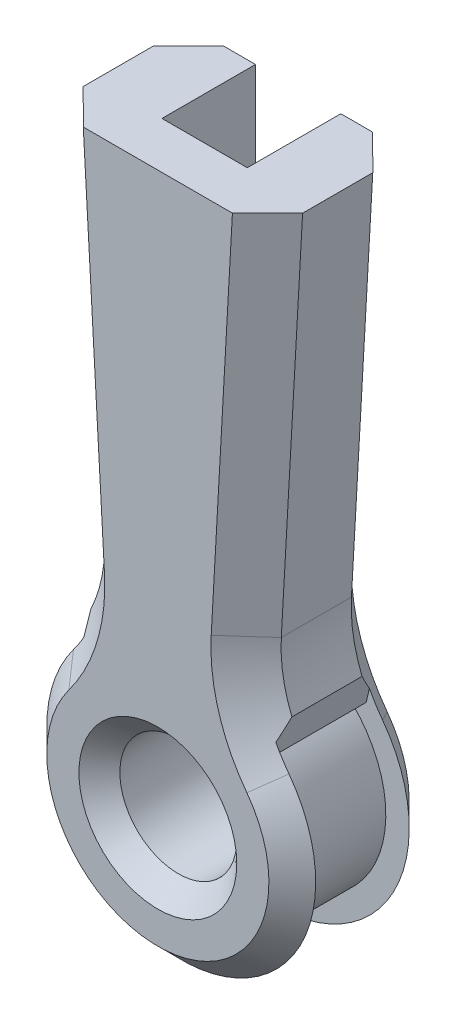
ISO-10303-21;
HEADER;
FILE_DESCRIPTION(('STEP AP214'),'2;1');
FILE_NAME('part.step','',(''),(''),'','','');
FILE_SCHEMA(('AUTOMOTIVE_DESIGN { 1 0 10303 214 1 1 1 1 }'));
ENDSEC;
DATA;
#1=APPLICATION_CONTEXT('core data for automotive mechanical design processes');
#2=APPLICATION_PROTOCOL_DEFINITION('international standard','automotive_design',2000,#1);
#3=PRODUCT_CONTEXT('',#1,'mechanical');
#4=PRODUCT('Part','Part','',(#3));
#5=PRODUCT_RELATED_PRODUCT_CATEGORY('part','',(#4));
#6=PRODUCT_DEFINITION_FORMATION('','',#4);
#7=PRODUCT_DEFINITION_CONTEXT('part definition',#1,'design');
#8=PRODUCT_DEFINITION('design','',#6,#7);
#9=PRODUCT_DEFINITION_SHAPE('','',#8);
#10=(LENGTH_UNIT() NAMED_UNIT(*) SI_UNIT(.MILLI.,.METRE.));
#11=(NAMED_UNIT(*) PLANE_ANGLE_UNIT() SI_UNIT($,.RADIAN.));
#12=(NAMED_UNIT(*) SI_UNIT($,.STERADIAN.) SOLID_ANGLE_UNIT());
#13=UNCERTAINTY_MEASURE_WITH_UNIT(LENGTH_MEASURE(1.E-05),#10,'distance_accuracy_value','');
#14=(GEOMETRIC_REPRESENTATION_CONTEXT(3) GLOBAL_UNCERTAINTY_ASSIGNED_CONTEXT((#13)) GLOBAL_UNIT_ASSIGNED_CONTEXT((#10,
#11,#12)) REPRESENTATION_CONTEXT('',''));
#15=CARTESIAN_POINT('',(0.,0.,0.));
#16=DIRECTION('',(0.,0.,1.));
#17=DIRECTION('',(1.,0.,0.));
#18=AXIS2_PLACEMENT_3D('',#15,#16,#17);
#19=CARTESIAN_POINT('',(0.,-148.,3.));
#20=DIRECTION('',(0.,0.,1.));
#21=DIRECTION('',(1.,0.,0.));
#22=AXIS2_PLACEMENT_3D('',#19,#20,#21);
#23=CONICAL_SURFACE('',#22,12.5,0.785398163397449);
#24=DIRECTION('',(-0.56677950459761,-0.422801363725436,-0.707106781186547));
#25=VECTOR('',#24,1.);
#26=CARTESIAN_POINT('',(10.0193407784631,-140.525857215371,3.));
#27=LINE('',#26,#25);
#28=CARTESIAN_POINT('',(9.21779351618603,-141.123788638141,2.));
#29=VERTEX_POINT('',#28);
#30=CARTESIAN_POINT('',(7.61469899163194,-142.319651483682,0.));
#31=VERTEX_POINT('',#30);
#32=EDGE_CURVE('E340',#29,#31,#27,.T.);
#33=ORIENTED_EDGE('',*,*,#32,.F.);
#34=CARTESIAN_POINT('',(0.,-148.,2.));
#35=DIRECTION('',(0.,0.,1.));
#36=DIRECTION('',(1.,0.,0.));
#37=AXIS2_PLACEMENT_3D('',#34,#35,#36);
#38=CIRCLE('',#37,11.5);
#39=CARTESIAN_POINT('',(-9.21779351618602,-141.123788638141,2.));
#40=VERTEX_POINT('',#39);
#41=EDGE_CURVE('E278',#29,#40,#38,.F.);
#42=ORIENTED_EDGE('',*,*,#41,.T.);
#43=DIRECTION('',(0.566779504597611,-0.422801363725435,-0.707106781186547));
#44=VECTOR('',#43,1.);
#45=CARTESIAN_POINT('',(-10.0193407784631,-140.525857215371,3.));
#46=LINE('',#45,#44);
#47=CARTESIAN_POINT('',(-7.61469899163192,-142.319651483682,0.));
#48=VERTEX_POINT('',#47);
#49=EDGE_CURVE('E288',#40,#48,#46,.T.);
#50=ORIENTED_EDGE('',*,*,#49,.T.);
#51=CARTESIAN_POINT('',(0.,-148.,0.));
#52=DIRECTION('',(0.,0.,1.));
#53=DIRECTION('',(1.,0.,0.));
#54=AXIS2_PLACEMENT_3D('',#51,#52,#53);
#55=CIRCLE('',#54,9.5);
#56=EDGE_CURVE('E301',#31,#48,#55,.F.);
#57=ORIENTED_EDGE('',*,*,#56,.F.);
#58=EDGE_LOOP('',(#33,#42,#50,#57));
#59=FACE_BOUND('',#58,.T.);
#60=ADVANCED_FACE('F45',(#59),#23,.T.);
#61=CARTESIAN_POINT('',(0.,0.,12.));
#62=DIRECTION('',(0.,0.,1.));
#63=DIRECTION('',(1.,0.,0.));
#64=AXIS2_PLACEMENT_3D('',#61,#62,#63);
#65=PLANE('',#64);
#66=DIRECTION('',(1.,0.,0.));
#67=VECTOR('',#66,1.);
#68=CARTESIAN_POINT('',(0.,-100.,12.));
#69=LINE('',#68,#67);
#70=CARTESIAN_POINT('',(-6.37838689244292,-100.,12.));
#71=VERTEX_POINT('',#70);
#72=CARTESIAN_POINT('',(6.37838689244295,-100.,12.));
#73=VERTEX_POINT('',#72);
#74=EDGE_CURVE('E70',#71,#73,#69,.T.);
#75=ORIENTED_EDGE('',*,*,#74,.F.);
#76=DIRECTION('',(0.0563173613062711,-0.998412917993101,0.));
#77=VECTOR('',#76,1.);
#78=CARTESIAN_POINT('',(-4.56328132803304,-132.178795330494,12.));
#79=LINE('',#78,#77);
#80=CARTESIAN_POINT('',(-4.56328132803304,-132.178795330494,12.));
#81=VERTEX_POINT('',#80);
#82=EDGE_CURVE('E324',#71,#81,#79,.T.);
#83=ORIENTED_EDGE('',*,*,#82,.T.);
#84=CARTESIAN_POINT('',(-20.0386815569261,-133.051714430741,12.));
#85=DIRECTION('',(0.,0.,1.));
#86=DIRECTION('',(1.,0.,0.));
#87=AXIS2_PLACEMENT_3D('',#84,#85,#86);
#88=CIRCLE('',#87,15.5);
#89=CARTESIAN_POINT('',(-7.61469899163193,-142.319651483682,12.));
#90=VERTEX_POINT('',#89);
#91=EDGE_CURVE('E326',#81,#90,#88,.F.);
#92=ORIENTED_EDGE('',*,*,#91,.T.);
#93=CARTESIAN_POINT('',(0.,-148.,12.));
#94=DIRECTION('',(0.,0.,1.));
#95=DIRECTION('',(1.,0.,0.));
#96=AXIS2_PLACEMENT_3D('',#93,#94,#95);
#97=CIRCLE('',#96,9.5);
#98=CARTESIAN_POINT('',(7.61469899163194,-142.319651483682,12.));
#99=VERTEX_POINT('',#98);
#100=EDGE_CURVE('E328',#90,#99,#97,.T.);
#101=ORIENTED_EDGE('',*,*,#100,.T.);
#102=CARTESIAN_POINT('',(20.0386815569262,-133.051714430741,12.));
#103=DIRECTION('',(0.,0.,1.));
#104=DIRECTION('',(1.,0.,0.));
#105=AXIS2_PLACEMENT_3D('',#102,#103,#104);
#106=CIRCLE('',#105,15.5);
#107=CARTESIAN_POINT('',(4.56328132803308,-132.178795330494,12.));
#108=VERTEX_POINT('',#107);
#109=EDGE_CURVE('E330',#99,#108,#106,.F.);
#110=ORIENTED_EDGE('',*,*,#109,.T.);
#111=DIRECTION('',(0.0563173613062709,0.998412917993101,0.));
#112=VECTOR('',#111,1.);
#113=CARTESIAN_POINT('',(11.9809550159172,-0.67580833567525,12.));
#114=LINE('',#113,#112);
#115=EDGE_CURVE('E333',#108,#73,#114,.T.);
#116=ORIENTED_EDGE('',*,*,#115,.T.);
#117=EDGE_LOOP('',(#75,#83,#92,#101,#110,#116));
#118=FACE_BOUND('',#117,.T.);
#119=CARTESIAN_POINT('',(0.,-148.,12.));
#120=DIRECTION('',(0.,0.,1.));
#121=DIRECTION('',(1.,0.,0.));
#122=AXIS2_PLACEMENT_3D('',#119,#120,#121);
#123=CIRCLE('',#122,6.75000000000003);
#124=CARTESIAN_POINT('',(6.75000000000003,-148.,12.));
#125=VERTEX_POINT('',#124);
#126=EDGE_CURVE('E361',#125,#125,#123,.F.);
#127=ORIENTED_EDGE('',*,*,#126,.T.);
#128=EDGE_LOOP('',(#127));
#129=FACE_BOUND('',#128,.T.);
#130=ADVANCED_FACE('F451',(#118,#129),#65,.T.);
#131=CARTESIAN_POINT('',(0.,0.,0.));
#132=DIRECTION('',(0.,0.,1.));
#133=DIRECTION('',(1.,0.,0.));
#134=AXIS2_PLACEMENT_3D('',#131,#132,#133);
#135=PLANE('',#134);
#136=CARTESIAN_POINT('',(0.,-148.,0.));
#137=DIRECTION('',(0.,0.,1.));
#138=DIRECTION('',(1.,0.,0.));
#139=AXIS2_PLACEMENT_3D('',#136,#137,#138);
#140=CIRCLE('',#139,6.75000000000003);
#141=CARTESIAN_POINT('',(6.75000000000003,-148.,0.));
#142=VERTEX_POINT('',#141);
#143=EDGE_CURVE('E364',#142,#142,#140,.T.);
#144=ORIENTED_EDGE('',*,*,#143,.T.);
#145=EDGE_LOOP('',(#144));
#146=FACE_BOUND('',#145,.T.);
#147=DIRECTION('',(-1.,0.,0.));
#148=VECTOR('',#147,1.);
#149=CARTESIAN_POINT('',(3.65,-120.3,0.));
#150=LINE('',#149,#148);
#151=CARTESIAN_POINT('',(3.65,-120.3,0.));
#152=VERTEX_POINT('',#151);
#153=CARTESIAN_POINT('',(-3.65,-120.3,0.));
#154=VERTEX_POINT('',#153);
#155=EDGE_CURVE('E232',#152,#154,#150,.T.);
#156=ORIENTED_EDGE('',*,*,#155,.F.);
#157=DIRECTION('',(0.,-1.,0.));
#158=VECTOR('',#157,1.);
#159=CARTESIAN_POINT('',(3.65,-120.3,0.));
#160=LINE('',#159,#158);
#161=CARTESIAN_POINT('',(3.65,-100.,0.));
#162=VERTEX_POINT('',#161);
#163=EDGE_CURVE('E221',#162,#152,#160,.T.);
#164=ORIENTED_EDGE('',*,*,#163,.F.);
#165=DIRECTION('',(-1.,0.,0.));
#166=VECTOR('',#165,1.);
#167=CARTESIAN_POINT('',(29.4682113100847,-100.,0.));
#168=LINE('',#167,#166);
#169=CARTESIAN_POINT('',(6.37838689244295,-100.,0.));
#170=VERTEX_POINT('',#169);
#171=EDGE_CURVE('E237',#170,#162,#168,.T.);
#172=ORIENTED_EDGE('',*,*,#171,.F.);
#173=DIRECTION('',(-0.0563173613062709,-0.998412917993101,0.));
#174=VECTOR('',#173,1.);
#175=CARTESIAN_POINT('',(11.9809550159172,-0.67580833567525,0.));
#176=LINE('',#175,#174);
#177=CARTESIAN_POINT('',(4.56328132803308,-132.178795330494,0.));
#178=VERTEX_POINT('',#177);
#179=EDGE_CURVE('E307',#170,#178,#176,.T.);
#180=ORIENTED_EDGE('',*,*,#179,.T.);
#181=CARTESIAN_POINT('',(20.0386815569262,-133.051714430741,0.));
#182=DIRECTION('',(0.,0.,1.));
#183=DIRECTION('',(1.,0.,0.));
#184=AXIS2_PLACEMENT_3D('',#181,#182,#183);
#185=CIRCLE('',#184,15.5);
#186=EDGE_CURVE('E304',#178,#31,#185,.T.);
#187=ORIENTED_EDGE('',*,*,#186,.T.);
#188=ORIENTED_EDGE('',*,*,#56,.T.);
#189=CARTESIAN_POINT('',(-20.0386815569261,-133.051714430741,0.));
#190=DIRECTION('',(0.,0.,1.));
#191=DIRECTION('',(1.,0.,0.));
#192=AXIS2_PLACEMENT_3D('',#189,#190,#191);
#193=CIRCLE('',#192,15.5);
#194=CARTESIAN_POINT('',(-4.56328132803304,-132.178795330494,0.));
#195=VERTEX_POINT('',#194);
#196=EDGE_CURVE('E299',#48,#195,#193,.T.);
#197=ORIENTED_EDGE('',*,*,#196,.T.);
#198=DIRECTION('',(-0.0563173613062711,0.998412917993101,0.));
#199=VECTOR('',#198,1.);
#200=CARTESIAN_POINT('',(-11.9809550159172,-0.675808335675253,0.));
#201=LINE('',#200,#199);
#202=CARTESIAN_POINT('',(-6.37838689244293,-100.,0.));
#203=VERTEX_POINT('',#202);
#204=EDGE_CURVE('E296',#195,#203,#201,.T.);
#205=ORIENTED_EDGE('',*,*,#204,.T.);
#206=CARTESIAN_POINT('',(-3.65,-100.,0.));
#207=VERTEX_POINT('',#206);
#208=EDGE_CURVE('E235',#207,#203,#168,.T.);
#209=ORIENTED_EDGE('',*,*,#208,.F.);
#210=DIRECTION('',(0.,1.,0.));
#211=VECTOR('',#210,1.);
#212=CARTESIAN_POINT('',(-3.65,-120.3,0.));
#213=LINE('',#212,#211);
#214=EDGE_CURVE('E215',#154,#207,#213,.T.);
#215=ORIENTED_EDGE('',*,*,#214,.F.);
#216=EDGE_LOOP('',(#156,#164,#172,#180,#187,#188,#197,#205,#209,#215));
#217=FACE_BOUND('',#216,.T.);
#218=ADVANCED_FACE('F456',(#146,#217),#135,.F.);
#219=CARTESIAN_POINT('',(-14.9761937698965,-0.844760419594066,12.));
#220=DIRECTION('',(0.998412917993101,0.0563173613062711,0.));
#221=DIRECTION('',(-0.0563173613062711,0.998412917993101,0.));
#222=AXIS2_PLACEMENT_3D('',#219,#220,#221);
#223=PLANE('',#222);
#224=DIRECTION('',(-0.0563173613062711,0.998412917993101,0.));
#225=VECTOR('',#224,1.);
#226=CARTESIAN_POINT('',(-14.9761937698965,-0.844760419594066,8.99999999999997));
#227=LINE('',#226,#225);
#228=CARTESIAN_POINT('',(-7.55852008201235,-132.347747414413,8.99999999999997));
#229=VERTEX_POINT('',#228);
#230=CARTESIAN_POINT('',(-9.38315570696334,-100.,8.99999999999997));
#231=VERTEX_POINT('',#230);
#232=EDGE_CURVE('E309',#229,#231,#227,.T.);
#233=ORIENTED_EDGE('',*,*,#232,.T.);
#234=DIRECTION('',(0.,0.,-1.));
#235=VECTOR('',#234,1.);
#236=CARTESIAN_POINT('',(-9.38315570696334,-100.,12.));
#237=LINE('',#236,#235);
#238=CARTESIAN_POINT('',(-9.38315570696334,-100.,3.00000000000001));
#239=VERTEX_POINT('',#238);
#240=EDGE_CURVE('E248',#231,#239,#237,.T.);
#241=ORIENTED_EDGE('',*,*,#240,.T.);
#242=DIRECTION('',(0.0563173613062711,-0.998412917993101,0.));
#243=VECTOR('',#242,1.);
#244=CARTESIAN_POINT('',(-14.9761937698965,-0.844760419594066,3.));
#245=LINE('',#244,#243);
#246=CARTESIAN_POINT('',(-7.55852008201235,-132.347747414413,3.));
#247=VERTEX_POINT('',#246);
#248=EDGE_CURVE('E312',#239,#247,#245,.T.);
#249=ORIENTED_EDGE('',*,*,#248,.T.);
#250=DIRECTION('',(0.,0.,1.));
#251=VECTOR('',#250,1.);
#252=CARTESIAN_POINT('',(-7.55852008201235,-132.347747414413,12.));
#253=LINE('',#252,#251);
#254=EDGE_CURVE('E284',#247,#229,#253,.T.);
#255=ORIENTED_EDGE('',*,*,#254,.T.);
#256=EDGE_LOOP('',(#233,#241,#249,#255));
#257=FACE_BOUND('',#256,.T.);
#258=ADVANCED_FACE('F515',(#257),#223,.F.);
#259=CARTESIAN_POINT('',(14.9761937698965,-0.844760419594063,12.));
#260=DIRECTION('',(-0.998412917993101,0.0563173613062709,0.));
#261=DIRECTION('',(-0.0563173613062709,-0.998412917993101,0.));
#262=AXIS2_PLACEMENT_3D('',#259,#260,#261);
#263=PLANE('',#262);
#264=DIRECTION('',(0.0563173613062709,0.998412917993101,0.));
#265=VECTOR('',#264,1.);
#266=CARTESIAN_POINT('',(14.9761937698965,-0.844760419594063,3.));
#267=LINE('',#266,#265);
#268=CARTESIAN_POINT('',(7.55852008201238,-132.347747414413,3.));
#269=VERTEX_POINT('',#268);
#270=CARTESIAN_POINT('',(9.38315570696337,-100.,3.00000000000001));
#271=VERTEX_POINT('',#270);
#272=EDGE_CURVE('E293',#269,#271,#267,.T.);
#273=ORIENTED_EDGE('',*,*,#272,.T.);
#274=DIRECTION('',(0.,0.,1.));
#275=VECTOR('',#274,1.);
#276=CARTESIAN_POINT('',(9.38315570696337,-100.,12.));
#277=LINE('',#276,#275);
#278=CARTESIAN_POINT('',(9.38315570696337,-100.,8.99999999999997));
#279=VERTEX_POINT('',#278);
#280=EDGE_CURVE('E240',#271,#279,#277,.T.);
#281=ORIENTED_EDGE('',*,*,#280,.T.);
#282=DIRECTION('',(-0.0563173613062709,-0.998412917993101,0.));
#283=VECTOR('',#282,1.);
#284=CARTESIAN_POINT('',(7.55852008201238,-132.347747414413,8.99999999999997));
#285=LINE('',#284,#283);
#286=CARTESIAN_POINT('',(7.55852008201238,-132.347747414413,8.99999999999997));
#287=VERTEX_POINT('',#286);
#288=EDGE_CURVE('E291',#279,#287,#285,.T.);
#289=ORIENTED_EDGE('',*,*,#288,.T.);
#290=DIRECTION('',(0.,0.,1.));
#291=VECTOR('',#290,1.);
#292=CARTESIAN_POINT('',(7.55852008201238,-132.347747414413,0.));
#293=LINE('',#292,#291);
#294=EDGE_CURVE('E287',#287,#269,#293,.F.);
#295=ORIENTED_EDGE('',*,*,#294,.T.);
#296=EDGE_LOOP('',(#273,#281,#289,#295));
#297=FACE_BOUND('',#296,.T.);
#298=ADVANCED_FACE('F535',(#297),#263,.F.);
#299=CARTESIAN_POINT('',(0.,-148.,12.));
#300=DIRECTION('',(0.,0.,-1.));
#301=DIRECTION('',(-1.,0.,0.));
#302=AXIS2_PLACEMENT_3D('',#299,#300,#301);
#303=CYLINDRICAL_SURFACE('',#302,5.00000000000001);
#304=CARTESIAN_POINT('',(0.,-148.,10.25));
#305=DIRECTION('',(0.,0.,1.));
#306=DIRECTION('',(1.,0.,0.));
#307=AXIS2_PLACEMENT_3D('',#304,#305,#306);
#308=CIRCLE('',#307,5.00000000000001);
#309=CARTESIAN_POINT('',(5.00000000000001,-148.,10.25));
#310=VERTEX_POINT('',#309);
#311=EDGE_CURVE('E358',#310,#310,#308,.T.);
#312=ORIENTED_EDGE('',*,*,#311,.T.);
#313=EDGE_LOOP('',(#312));
#314=FACE_BOUND('',#313,.T.);
#315=CARTESIAN_POINT('',(0.,-148.,1.75000000000004));
#316=DIRECTION('',(0.,0.,1.));
#317=DIRECTION('',(1.,0.,0.));
#318=AXIS2_PLACEMENT_3D('',#315,#316,#317);
#319=CIRCLE('',#318,5.00000000000001);
#320=CARTESIAN_POINT('',(5.00000000000001,-148.,1.75000000000004));
#321=VERTEX_POINT('',#320);
#322=EDGE_CURVE('E336',#321,#321,#319,.F.);
#323=ORIENTED_EDGE('',*,*,#322,.T.);
#324=EDGE_LOOP('',(#323));
#325=FACE_BOUND('',#324,.T.);
#326=ADVANCED_FACE('F623',(#314,#325),#303,.F.);
#327=CARTESIAN_POINT('',(-20.0386815569261,-133.051714430741,12.));
#328=DIRECTION('',(0.,0.,-1.));
#329=DIRECTION('',(-1.,0.,0.));
#330=AXIS2_PLACEMENT_3D('',#327,#328,#329);
#331=CYLINDRICAL_SURFACE('',#330,12.5);
#332=CARTESIAN_POINT('',(-20.0386815569261,-133.051714430741,3.));
#333=DIRECTION('',(0.,0.,1.));
#334=DIRECTION('',(1.,0.,0.));
#335=AXIS2_PLACEMENT_3D('',#332,#333,#334);
#336=CIRCLE('',#335,12.5);
#337=CARTESIAN_POINT('',(-8.73789473468378,-138.394206096456,3.));
#338=VERTEX_POINT('',#337);
#339=EDGE_CURVE('E321',#247,#338,#336,.F.);
#340=ORIENTED_EDGE('',*,*,#339,.T.);
#341=DIRECTION('',(0.,0.,-1.));
#342=VECTOR('',#341,1.);
#343=CARTESIAN_POINT('',(-8.73789473468378,-138.394206096456,12.));
#344=LINE('',#343,#342);
#345=CARTESIAN_POINT('',(-8.73789473468378,-138.394206096456,8.99999999999997));
#346=VERTEX_POINT('',#345);
#347=EDGE_CURVE('E382',#338,#346,#344,.F.);
#348=ORIENTED_EDGE('',*,*,#347,.T.);
#349=CARTESIAN_POINT('',(-20.0386815569261,-133.051714430741,8.99999999999997));
#350=DIRECTION('',(0.,0.,1.));
#351=DIRECTION('',(1.,0.,0.));
#352=AXIS2_PLACEMENT_3D('',#349,#350,#351);
#353=CIRCLE('',#352,12.5);
#354=EDGE_CURVE('E319',#346,#229,#353,.T.);
#355=ORIENTED_EDGE('',*,*,#354,.T.);
#356=ORIENTED_EDGE('',*,*,#254,.F.);
#357=EDGE_LOOP('',(#340,#348,#355,#356));
#358=FACE_BOUND('',#357,.T.);
#359=ADVANCED_FACE('F551',(#358),#331,.F.);
#360=CARTESIAN_POINT('',(20.0386815569262,-133.051714430741,12.));
#361=DIRECTION('',(0.,0.,-1.));
#362=DIRECTION('',(-1.,0.,0.));
#363=AXIS2_PLACEMENT_3D('',#360,#361,#362);
#364=CYLINDRICAL_SURFACE('',#363,12.5);
#365=CARTESIAN_POINT('',(20.0386815569262,-133.051714430741,8.99999999999997));
#366=DIRECTION('',(0.,0.,1.));
#367=DIRECTION('',(1.,0.,0.));
#368=AXIS2_PLACEMENT_3D('',#365,#366,#367);
#369=CIRCLE('',#368,12.5);
#370=CARTESIAN_POINT('',(8.46493919013486,-137.773841877893,8.99999999999997));
#371=VERTEX_POINT('',#370);
#372=EDGE_CURVE('E314',#287,#371,#369,.T.);
#373=ORIENTED_EDGE('',*,*,#372,.T.);
#374=DIRECTION('',(0.,0.,-1.));
#375=VECTOR('',#374,1.);
#376=CARTESIAN_POINT('',(8.46493919013486,-137.773841877893,12.));
#377=LINE('',#376,#375);
#378=CARTESIAN_POINT('',(8.46493919013486,-137.773841877893,3.));
#379=VERTEX_POINT('',#378);
#380=EDGE_CURVE('E490',#371,#379,#377,.T.);
#381=ORIENTED_EDGE('',*,*,#380,.T.);
#382=CARTESIAN_POINT('',(20.0386815569262,-133.051714430741,3.));
#383=DIRECTION('',(0.,0.,1.));
#384=DIRECTION('',(1.,0.,0.));
#385=AXIS2_PLACEMENT_3D('',#382,#383,#384);
#386=CIRCLE('',#385,12.5);
#387=EDGE_CURVE('E317',#379,#269,#386,.F.);
#388=ORIENTED_EDGE('',*,*,#387,.T.);
#389=ORIENTED_EDGE('',*,*,#294,.F.);
#390=EDGE_LOOP('',(#373,#381,#388,#389));
#391=FACE_BOUND('',#390,.T.);
#392=ADVANCED_FACE('F562',(#391),#364,.F.);
#393=CARTESIAN_POINT('',(-20.0386815569261,-133.051714430741,0.));
#394=DIRECTION('',(0.,0.,-1.));
#395=DIRECTION('',(-1.,0.,0.));
#396=AXIS2_PLACEMENT_3D('',#393,#394,#395);
#397=CONICAL_SURFACE('',#396,15.5,0.785398163397449);
#398=CARTESIAN_POINT('',(-20.0386815569261,-133.051714430741,2.));
#399=DIRECTION('',(0.,0.,1.));
#400=DIRECTION('',(1.,0.,0.));
#401=AXIS2_PLACEMENT_3D('',#398,#399,#400);
#402=CIRCLE('',#401,13.5);
#403=CARTESIAN_POINT('',(-8.34472550527088,-139.797186383241,2.));
#404=VERTEX_POINT('',#403);
#405=EDGE_CURVE('E281',#40,#404,#402,.T.);
#406=ORIENTED_EDGE('',*,*,#405,.T.);
#407=CARTESIAN_POINT('',(-8.34472550527088,-139.797186383241,2.));
#408=CARTESIAN_POINT('',(-8.37705683128127,-139.681815673519,2.08565066544466));
#409=CARTESIAN_POINT('',(-8.40948743239469,-139.566090711729,2.17078839612603));
#410=CARTESIAN_POINT('',(-8.47455764509215,-139.333894957733,2.33993325094384));
#411=CARTESIAN_POINT('',(-8.50719723510438,-139.217424242504,2.42394048907926));
#412=CARTESIAN_POINT('',(-8.57270283687168,-138.983674851458,2.59073805021443));
#413=CARTESIAN_POINT('',(-8.60556885129342,-138.866396166125,2.67352835884592));
#414=CARTESIAN_POINT('',(-8.67154541087083,-138.630966214968,2.83778652933481));
#415=CARTESIAN_POINT('',(-8.70465598054099,-138.512814861667,2.91925425592396));
#416=CARTESIAN_POINT('',(-8.73789473468378,-138.394206096456,3.));
#417=B_SPLINE_CURVE_WITH_KNOTS('',3,(#407,#408,#409,#410,#411,#412,#413,#414,#415,#416),
.UNSPECIFIED.,.F.,.F.,(4,2,2,2,4),(0.,0.441843677195251,0.883642459824597,1.32544645457914,
1.76729535411745),.UNSPECIFIED.);
#418=EDGE_CURVE('E375',#404,#338,#417,.T.);
#419=ORIENTED_EDGE('',*,*,#418,.T.);
#420=ORIENTED_EDGE('',*,*,#339,.F.);
#421=DIRECTION('',(-0.705984544737171,-0.0398223880781978,0.707106781186547));
#422=VECTOR('',#421,1.);
#423=CARTESIAN_POINT('',(-4.56328132803304,-132.178795330494,0.));
#424=LINE('',#423,#422);
#425=EDGE_CURVE('E343',#195,#247,#424,.T.);
#426=ORIENTED_EDGE('',*,*,#425,.F.);
#427=ORIENTED_EDGE('',*,*,#196,.F.);
#428=ORIENTED_EDGE('',*,*,#49,.F.);
#429=EDGE_LOOP('',(#406,#419,#420,#426,#427,#428));
#430=FACE_BOUND('',#429,.T.);
#431=ADVANCED_FACE('F385',(#430),#397,.F.);
#432=CARTESIAN_POINT('',(-14.9761937698965,-0.844760419594066,3.));
#433=DIRECTION('',(0.70598454473717,0.0398223880781972,0.707106781186548));
#434=DIRECTION('',(0.0563173613062711,-0.998412917993101,0.));
#435=AXIS2_PLACEMENT_3D('',#432,#433,#434);
#436=PLANE('',#435);
#437=DIRECTION('',(0.70766812186927,0.,-0.706544994526195));
#438=VECTOR('',#437,1.);
#439=CARTESIAN_POINT('',(-12.1841165654393,-100.,5.79651550389546));
#440=LINE('',#439,#438);
#441=EDGE_CURVE('E251',#203,#239,#440,.F.);
#442=ORIENTED_EDGE('',*,*,#441,.F.);
#443=ORIENTED_EDGE('',*,*,#204,.F.);
#444=ORIENTED_EDGE('',*,*,#425,.T.);
#445=ORIENTED_EDGE('',*,*,#248,.F.);
#446=EDGE_LOOP('',(#442,#443,#444,#445));
#447=FACE_BOUND('',#446,.T.);
#448=ADVANCED_FACE('F465',(#447),#436,.F.);
#449=CARTESIAN_POINT('',(20.0386815569262,-133.051714430741,0.));
#450=DIRECTION('',(0.,0.,-1.));
#451=DIRECTION('',(-1.,0.,0.));
#452=AXIS2_PLACEMENT_3D('',#449,#450,#451);
#453=CONICAL_SURFACE('',#452,15.5,0.785398163397448);
#454=CARTESIAN_POINT('',(8.46493919013486,-137.773841877893,3.));
#455=CARTESIAN_POINT('',(8.43351759752117,-137.906991768959,2.92060298992841));
#456=CARTESIAN_POINT('',(8.40224441753454,-138.039512757303,2.84009887787652));
#457=CARTESIAN_POINT('',(8.33998420024125,-138.303342196259,2.67707654162311));
#458=CARTESIAN_POINT('',(8.30899710958229,-138.434650872952,2.59455870386005));
#459=CARTESIAN_POINT('',(8.2472871312439,-138.696148658709,2.42768051410641));
#460=CARTESIAN_POINT('',(8.21656423761577,-138.826337792981,2.34332020375339));
#461=CARTESIAN_POINT('',(8.15536046037285,-139.085690537221,2.17289547716125));
#462=CARTESIAN_POINT('',(8.12487962395216,-139.214853947202,2.08683073950789));
#463=CARTESIAN_POINT('',(8.09451491925204,-139.343525245719,2.00000000000001));
#464=B_SPLINE_CURVE_WITH_KNOTS('',3,(#454,#455,#456,#457,#458,#459,#460,#461,#462,#463),
.UNSPECIFIED.,.F.,.F.,(4,2,2,2,4),(0.,0.474522499172708,0.948954641591617,1.42337607351251,
1.89788783831843),.UNSPECIFIED.);
#465=CARTESIAN_POINT('',(8.09451491925203,-139.343525245719,2.));
#466=VERTEX_POINT('',#465);
#467=EDGE_CURVE('E481',#379,#466,#464,.T.);
#468=ORIENTED_EDGE('',*,*,#467,.T.);
#469=CARTESIAN_POINT('',(20.0386815569262,-133.051714430741,2.));
#470=DIRECTION('',(0.,0.,1.));
#471=DIRECTION('',(1.,0.,0.));
#472=AXIS2_PLACEMENT_3D('',#469,#470,#471);
#473=CIRCLE('',#472,13.5);
#474=EDGE_CURVE('E369',#466,#29,#473,.T.);
#475=ORIENTED_EDGE('',*,*,#474,.T.);
#476=ORIENTED_EDGE('',*,*,#32,.T.);
#477=ORIENTED_EDGE('',*,*,#186,.F.);
#478=DIRECTION('',(-0.705984544737171,0.0398223880781978,-0.707106781186547));
#479=VECTOR('',#478,1.);
#480=CARTESIAN_POINT('',(7.55852008201239,-132.347747414413,3.));
#481=LINE('',#480,#479);
#482=EDGE_CURVE('E337',#269,#178,#481,.T.);
#483=ORIENTED_EDGE('',*,*,#482,.F.);
#484=ORIENTED_EDGE('',*,*,#387,.F.);
#485=EDGE_LOOP('',(#468,#475,#476,#477,#483,#484));
#486=FACE_BOUND('',#485,.T.);
#487=ADVANCED_FACE('F471',(#486),#453,.F.);
#488=CARTESIAN_POINT('',(14.9761937698965,-0.844760419594063,3.));
#489=DIRECTION('',(-0.70598454473717,0.039822388078197,0.707106781186548));
#490=DIRECTION('',(0.0563173613062709,0.998412917993101,0.));
#491=AXIS2_PLACEMENT_3D('',#488,#489,#490);
#492=PLANE('',#491);
#493=DIRECTION('',(0.70766812186927,0.,0.706544994526195));
#494=VECTOR('',#493,1.);
#495=CARTESIAN_POINT('',(12.1841165654393,-100.,5.79651550389544));
#496=LINE('',#495,#494);
#497=EDGE_CURVE('E246',#271,#170,#496,.F.);
#498=ORIENTED_EDGE('',*,*,#497,.F.);
#499=ORIENTED_EDGE('',*,*,#272,.F.);
#500=ORIENTED_EDGE('',*,*,#482,.T.);
#501=ORIENTED_EDGE('',*,*,#179,.F.);
#502=EDGE_LOOP('',(#498,#499,#500,#501));
#503=FACE_BOUND('',#502,.T.);
#504=ADVANCED_FACE('F430',(#503),#492,.F.);
#505=CARTESIAN_POINT('',(-11.9809550159172,-0.675808335675253,12.));
#506=DIRECTION('',(-0.705984544737173,-0.0398223880781974,0.707106781186544));
#507=DIRECTION('',(-0.0563173613062711,0.998412917993101,0.));
#508=AXIS2_PLACEMENT_3D('',#505,#506,#507);
#509=PLANE('',#508);
#510=DIRECTION('',(0.707668121869266,0.,0.706544994526198));
#511=VECTOR('',#510,1.);
#512=CARTESIAN_POINT('',(-9.18412034968437,-100.,9.19871947184467));
#513=LINE('',#512,#511);
#514=EDGE_CURVE('E244',#231,#71,#513,.T.);
#515=ORIENTED_EDGE('',*,*,#514,.F.);
#516=ORIENTED_EDGE('',*,*,#232,.F.);
#517=DIRECTION('',(-0.705984544737167,-0.0398223880781977,-0.707106781186551));
#518=VECTOR('',#517,1.);
#519=CARTESIAN_POINT('',(-4.56328132803304,-132.178795330494,12.));
#520=LINE('',#519,#518);
#521=EDGE_CURVE('E341',#81,#229,#520,.T.);
#522=ORIENTED_EDGE('',*,*,#521,.F.);
#523=ORIENTED_EDGE('',*,*,#82,.F.);
#524=EDGE_LOOP('',(#515,#516,#522,#523));
#525=FACE_BOUND('',#524,.T.);
#526=ADVANCED_FACE('F423',(#525),#509,.T.);
#527=CARTESIAN_POINT('',(-20.0386815569261,-133.051714430741,12.));
#528=DIRECTION('',(0.,0.,1.));
#529=DIRECTION('',(1.,0.,0.));
#530=AXIS2_PLACEMENT_3D('',#527,#528,#529);
#531=CONICAL_SURFACE('',#530,15.5,0.785398163397444);
#532=CARTESIAN_POINT('',(-8.73789473468378,-138.394206096456,8.99999999999997));
#533=CARTESIAN_POINT('',(-8.70465598054099,-138.512814861667,9.08074574407602));
#534=CARTESIAN_POINT('',(-8.67154541087083,-138.630966214968,9.16221347066518));
#535=CARTESIAN_POINT('',(-8.60556885129341,-138.866396166125,9.32647164115407));
#536=CARTESIAN_POINT('',(-8.57270283687167,-138.983674851458,9.40926194978557));
#537=CARTESIAN_POINT('',(-8.50719723510438,-139.217424242504,9.57605951092073));
#538=CARTESIAN_POINT('',(-8.47455764509215,-139.333894957733,9.66006674905614));
#539=CARTESIAN_POINT('',(-8.40948743239469,-139.566090711729,9.82921160387395));
#540=CARTESIAN_POINT('',(-8.37705683128127,-139.681815673519,9.91434933455532));
#541=CARTESIAN_POINT('',(-8.34472550527088,-139.797186383241,10.));
#542=B_SPLINE_CURVE_WITH_KNOTS('',3,(#532,#533,#534,#535,#536,#537,#538,#539,#540,#541),
.UNSPECIFIED.,.F.,.F.,(4,2,2,2,4),(0.,0.441848899538347,0.883652894292889,1.3254516769222,
1.76729535411749),.UNSPECIFIED.);
#543=CARTESIAN_POINT('',(-8.34472550527087,-139.797186383241,10.));
#544=VERTEX_POINT('',#543);
#545=EDGE_CURVE('E402',#346,#544,#542,.T.);
#546=ORIENTED_EDGE('',*,*,#545,.T.);
#547=CARTESIAN_POINT('',(-20.0386815569261,-133.051714430741,10.));
#548=DIRECTION('',(0.,0.,1.));
#549=DIRECTION('',(1.,0.,0.));
#550=AXIS2_PLACEMENT_3D('',#547,#548,#549);
#551=CIRCLE('',#550,13.5);
#552=CARTESIAN_POINT('',(-9.217793516186,-141.123788638141,10.));
#553=VERTEX_POINT('',#552);
#554=EDGE_CURVE('E276',#553,#544,#551,.T.);
#555=ORIENTED_EDGE('',*,*,#554,.F.);
#556=DIRECTION('',(-0.566779504597608,0.422801363725434,-0.70710678118655));
#557=VECTOR('',#556,1.);
#558=CARTESIAN_POINT('',(-7.61469899163193,-142.319651483682,12.));
#559=LINE('',#558,#557);
#560=EDGE_CURVE('E351',#90,#553,#559,.T.);
#561=ORIENTED_EDGE('',*,*,#560,.F.);
#562=ORIENTED_EDGE('',*,*,#91,.F.);
#563=ORIENTED_EDGE('',*,*,#521,.T.);
#564=ORIENTED_EDGE('',*,*,#354,.F.);
#565=EDGE_LOOP('',(#546,#555,#561,#562,#563,#564));
#566=FACE_BOUND('',#565,.T.);
#567=ADVANCED_FACE('F413',(#566),#531,.F.);
#568=CARTESIAN_POINT('',(0.,-148.,12.));
#569=DIRECTION('',(0.,0.,-1.));
#570=DIRECTION('',(-1.,0.,0.));
#571=AXIS2_PLACEMENT_3D('',#568,#569,#570);
#572=CONICAL_SURFACE('',#571,9.5,0.785398163397444);
#573=CARTESIAN_POINT('',(0.,-148.,10.));
#574=DIRECTION('',(0.,0.,1.));
#575=DIRECTION('',(1.,0.,0.));
#576=AXIS2_PLACEMENT_3D('',#573,#574,#575);
#577=CIRCLE('',#576,11.5);
#578=CARTESIAN_POINT('',(9.21779351618602,-141.123788638141,10.));
#579=VERTEX_POINT('',#578);
#580=EDGE_CURVE('E273',#579,#553,#577,.F.);
#581=ORIENTED_EDGE('',*,*,#580,.F.);
#582=DIRECTION('',(0.566779504597608,0.422801363725434,-0.70710678118655));
#583=VECTOR('',#582,1.);
#584=CARTESIAN_POINT('',(7.61469899163194,-142.319651483682,12.));
#585=LINE('',#584,#583);
#586=EDGE_CURVE('E348',#99,#579,#585,.T.);
#587=ORIENTED_EDGE('',*,*,#586,.F.);
#588=ORIENTED_EDGE('',*,*,#100,.F.);
#589=ORIENTED_EDGE('',*,*,#560,.T.);
#590=EDGE_LOOP('',(#581,#587,#588,#589));
#591=FACE_BOUND('',#590,.T.);
#592=ADVANCED_FACE('F422',(#591),#572,.T.);
#593=CARTESIAN_POINT('',(11.9809550159172,-0.67580833567525,12.));
#594=DIRECTION('',(0.705984544737173,-0.0398223880781972,0.707106781186545));
#595=DIRECTION('',(-0.0563173613062709,-0.998412917993101,0.));
#596=AXIS2_PLACEMENT_3D('',#593,#594,#595);
#597=PLANE('',#596);
#598=DIRECTION('',(0.707668121869266,0.,-0.706544994526198));
#599=VECTOR('',#598,1.);
#600=CARTESIAN_POINT('',(9.18412034968438,-100.,9.19871947184468));
#601=LINE('',#600,#599);
#602=EDGE_CURVE('E500',#73,#279,#601,.T.);
#603=ORIENTED_EDGE('',*,*,#602,.F.);
#604=ORIENTED_EDGE('',*,*,#115,.F.);
#605=DIRECTION('',(-0.705984544737167,0.0398223880781977,0.707106781186551));
#606=VECTOR('',#605,1.);
#607=CARTESIAN_POINT('',(7.55852008201238,-132.347747414413,8.99999999999997));
#608=LINE('',#607,#606);
#609=EDGE_CURVE('E283',#287,#108,#608,.T.);
#610=ORIENTED_EDGE('',*,*,#609,.F.);
#611=ORIENTED_EDGE('',*,*,#288,.F.);
#612=EDGE_LOOP('',(#603,#604,#610,#611));
#613=FACE_BOUND('',#612,.T.);
#614=ADVANCED_FACE('F446',(#613),#597,.T.);
#615=CARTESIAN_POINT('',(20.0386815569262,-133.051714430741,12.));
#616=DIRECTION('',(0.,0.,1.));
#617=DIRECTION('',(1.,0.,0.));
#618=AXIS2_PLACEMENT_3D('',#615,#616,#617);
#619=CONICAL_SURFACE('',#618,15.5,0.785398163397444);
#620=CARTESIAN_POINT('',(20.0386815569262,-133.051714430741,10.));
#621=DIRECTION('',(0.,0.,1.));
#622=DIRECTION('',(1.,0.,0.));
#623=AXIS2_PLACEMENT_3D('',#620,#621,#622);
#624=CIRCLE('',#623,13.5);
#625=CARTESIAN_POINT('',(8.09451491925203,-139.343525245719,10.));
#626=VERTEX_POINT('',#625);
#627=EDGE_CURVE('E367',#626,#579,#624,.T.);
#628=ORIENTED_EDGE('',*,*,#627,.F.);
#629=CARTESIAN_POINT('',(8.09451491925203,-139.343525245719,10.));
#630=CARTESIAN_POINT('',(8.12487962395215,-139.214853947202,9.91316926049213));
#631=CARTESIAN_POINT('',(8.15536046037283,-139.085690537221,9.82710452283877));
#632=CARTESIAN_POINT('',(8.21656423761576,-138.826337792982,9.65667979624663));
#633=CARTESIAN_POINT('',(8.2472871312439,-138.696148658709,9.5723194858936));
#634=CARTESIAN_POINT('',(8.30899710958229,-138.434650872952,9.40544129613994));
#635=CARTESIAN_POINT('',(8.33998420024124,-138.303342196259,9.32292345837687));
#636=CARTESIAN_POINT('',(8.40224441753454,-138.039512757303,9.15990112212345));
#637=CARTESIAN_POINT('',(8.43351759752117,-137.906991768959,9.07939701007156));
#638=CARTESIAN_POINT('',(8.46493919013486,-137.773841877893,8.99999999999996));
#639=B_SPLINE_CURVE_WITH_KNOTS('',3,(#629,#630,#631,#632,#633,#634,#635,#636,#637,#638),
.UNSPECIFIED.,.F.,.F.,(4,2,2,2,4),(0.,0.474511764805861,0.948933196726822,1.42336533914576,
1.89788783831848),.UNSPECIFIED.);
#640=EDGE_CURVE('E559',#626,#371,#639,.T.);
#641=ORIENTED_EDGE('',*,*,#640,.T.);
#642=ORIENTED_EDGE('',*,*,#372,.F.);
#643=ORIENTED_EDGE('',*,*,#609,.T.);
#644=ORIENTED_EDGE('',*,*,#109,.F.);
#645=ORIENTED_EDGE('',*,*,#586,.T.);
#646=EDGE_LOOP('',(#628,#641,#642,#643,#644,#645));
#647=FACE_BOUND('',#646,.T.);
#648=ADVANCED_FACE('F438',(#647),#619,.F.);
#649=CARTESIAN_POINT('',(0.,-148.,10.25));
#650=DIRECTION('',(0.,0.,1.));
#651=DIRECTION('',(1.,0.,0.));
#652=AXIS2_PLACEMENT_3D('',#649,#650,#651);
#653=CONICAL_SURFACE('',#652,5.00000000000001,0.78539816339745);
#654=ORIENTED_EDGE('',*,*,#126,.F.);
#655=EDGE_LOOP('',(#654));
#656=FACE_BOUND('',#655,.T.);
#657=ORIENTED_EDGE('',*,*,#311,.F.);
#658=EDGE_LOOP('',(#657));
#659=FACE_BOUND('',#658,.T.);
#660=ADVANCED_FACE('F433',(#656,#659),#653,.F.);
#661=CARTESIAN_POINT('',(0.,-148.,0.));
#662=DIRECTION('',(0.,0.,-1.));
#663=DIRECTION('',(-1.,0.,0.));
#664=AXIS2_PLACEMENT_3D('',#661,#662,#663);
#665=CONICAL_SURFACE('',#664,6.75000000000003,0.785398163397445);
#666=ORIENTED_EDGE('',*,*,#322,.F.);
#667=EDGE_LOOP('',(#666));
#668=FACE_BOUND('',#667,.T.);
#669=ORIENTED_EDGE('',*,*,#143,.F.);
#670=EDGE_LOOP('',(#669));
#671=FACE_BOUND('',#670,.T.);
#672=ADVANCED_FACE('F399',(#668,#671),#665,.F.);
#673=CARTESIAN_POINT('',(0.,-148.,2.));
#674=DIRECTION('',(0.,0.,1.));
#675=DIRECTION('',(1.,0.,0.));
#676=AXIS2_PLACEMENT_3D('',#673,#674,#675);
#677=CYLINDRICAL_SURFACE('',#676,9.50000000000001);
#678=CARTESIAN_POINT('',(0.,-148.,10.));
#679=DIRECTION('',(0.,0.,-1.));
#680=DIRECTION('',(1.,0.,0.));
#681=AXIS2_PLACEMENT_3D('',#678,#679,#680);
#682=CIRCLE('',#681,9.50000000000001);
#683=CARTESIAN_POINT('',(5.86405914320215,-140.525857215371,10.));
#684=VERTEX_POINT('',#683);
#685=CARTESIAN_POINT('',(-5.86405914320215,-140.525857215371,10.));
#686=VERTEX_POINT('',#685);
#687=EDGE_CURVE('E253',#684,#686,#682,.T.);
#688=ORIENTED_EDGE('',*,*,#687,.T.);
#689=DIRECTION('',(0.,0.,1.));
#690=VECTOR('',#689,1.);
#691=CARTESIAN_POINT('',(-5.86405914320215,-140.525857215371,2.));
#692=LINE('',#691,#690);
#693=CARTESIAN_POINT('',(-5.86405914320215,-140.525857215371,2.));
#694=VERTEX_POINT('',#693);
#695=EDGE_CURVE('E263',#694,#686,#692,.T.);
#696=ORIENTED_EDGE('',*,*,#695,.F.);
#697=CARTESIAN_POINT('',(0.,-148.,2.));
#698=DIRECTION('',(0.,0.,-1.));
#699=DIRECTION('',(1.,0.,0.));
#700=AXIS2_PLACEMENT_3D('',#697,#698,#699);
#701=CIRCLE('',#700,9.50000000000001);
#702=CARTESIAN_POINT('',(5.86405914320215,-140.525857215371,2.));
#703=VERTEX_POINT('',#702);
#704=EDGE_CURVE('E254',#703,#694,#701,.T.);
#705=ORIENTED_EDGE('',*,*,#704,.F.);
#706=DIRECTION('',(0.,0.,1.));
#707=VECTOR('',#706,1.);
#708=CARTESIAN_POINT('',(5.86405914320215,-140.525857215371,2.));
#709=LINE('',#708,#707);
#710=EDGE_CURVE('E270',#703,#684,#709,.T.);
#711=ORIENTED_EDGE('',*,*,#710,.T.);
#712=EDGE_LOOP('',(#688,#696,#705,#711));
#713=FACE_BOUND('',#712,.T.);
#714=ADVANCED_FACE('F444',(#713),#677,.T.);
#715=CARTESIAN_POINT('',(10.0193407784631,-140.525857215371,2.));
#716=DIRECTION('',(0.,1.,0.));
#717=DIRECTION('',(0.,0.,1.));
#718=AXIS2_PLACEMENT_3D('',#715,#716,#717);
#719=PLANE('',#718);
#720=DIRECTION('',(-1.,0.,0.));
#721=VECTOR('',#720,1.);
#722=CARTESIAN_POINT('',(10.0193407784631,-140.525857215371,2.));
#723=LINE('',#722,#721);
#724=CARTESIAN_POINT('',(7.81550039519167,-140.525857215371,2.));
#725=VERTEX_POINT('',#724);
#726=EDGE_CURVE('E261',#725,#703,#723,.T.);
#727=ORIENTED_EDGE('',*,*,#726,.F.);
#728=DIRECTION('',(0.,0.,1.));
#729=VECTOR('',#728,1.);
#730=CARTESIAN_POINT('',(7.81550039519167,-140.525857215371,2.));
#731=LINE('',#730,#729);
#732=CARTESIAN_POINT('',(7.81550039519167,-140.525857215371,10.));
#733=VERTEX_POINT('',#732);
#734=EDGE_CURVE('E410',#725,#733,#731,.T.);
#735=ORIENTED_EDGE('',*,*,#734,.T.);
#736=DIRECTION('',(-1.,0.,0.));
#737=VECTOR('',#736,1.);
#738=CARTESIAN_POINT('',(10.0193407784631,-140.525857215371,10.));
#739=LINE('',#738,#737);
#740=EDGE_CURVE('E258',#733,#684,#739,.T.);
#741=ORIENTED_EDGE('',*,*,#740,.T.);
#742=ORIENTED_EDGE('',*,*,#710,.F.);
#743=EDGE_LOOP('',(#727,#735,#741,#742));
#744=FACE_BOUND('',#743,.T.);
#745=ADVANCED_FACE('F697',(#744),#719,.F.);
#746=CARTESIAN_POINT('',(-5.86405914320215,-140.525857215371,2.));
#747=DIRECTION('',(0.,1.,0.));
#748=DIRECTION('',(0.,0.,1.));
#749=AXIS2_PLACEMENT_3D('',#746,#747,#748);
#750=PLANE('',#749);
#751=DIRECTION('',(-1.,0.,0.));
#752=VECTOR('',#751,1.);
#753=CARTESIAN_POINT('',(-5.86405914320215,-140.525857215371,10.));
#754=LINE('',#753,#752);
#755=CARTESIAN_POINT('',(-8.14052381244395,-140.525857215371,10.));
#756=VERTEX_POINT('',#755);
#757=EDGE_CURVE('E266',#686,#756,#754,.T.);
#758=ORIENTED_EDGE('',*,*,#757,.T.);
#759=DIRECTION('',(0.,0.,-1.));
#760=VECTOR('',#759,1.);
#761=CARTESIAN_POINT('',(-8.14052381244395,-140.525857215371,2.));
#762=LINE('',#761,#760);
#763=CARTESIAN_POINT('',(-8.14052381244395,-140.525857215371,2.));
#764=VERTEX_POINT('',#763);
#765=EDGE_CURVE('E372',#756,#764,#762,.T.);
#766=ORIENTED_EDGE('',*,*,#765,.T.);
#767=DIRECTION('',(-1.,0.,0.));
#768=VECTOR('',#767,1.);
#769=CARTESIAN_POINT('',(-5.86405914320215,-140.525857215371,2.));
#770=LINE('',#769,#768);
#771=EDGE_CURVE('E257',#694,#764,#770,.T.);
#772=ORIENTED_EDGE('',*,*,#771,.F.);
#773=ORIENTED_EDGE('',*,*,#695,.T.);
#774=EDGE_LOOP('',(#758,#766,#772,#773));
#775=FACE_BOUND('',#774,.T.);
#776=ADVANCED_FACE('F687',(#775),#750,.F.);
#777=CARTESIAN_POINT('',(0.,-148.,2.));
#778=DIRECTION('',(0.,0.,1.));
#779=DIRECTION('',(1.,0.,0.));
#780=AXIS2_PLACEMENT_3D('',#777,#778,#779);
#781=PLANE('',#780);
#782=ORIENTED_EDGE('',*,*,#41,.F.);
#783=ORIENTED_EDGE('',*,*,#474,.F.);
#784=DIRECTION('',(-0.229677916165548,-0.973266692549299,0.));
#785=VECTOR('',#784,1.);
#786=CARTESIAN_POINT('',(7.81550039519167,-140.525857215371,2.));
#787=LINE('',#786,#785);
#788=EDGE_CURVE('E498',#466,#725,#787,.T.);
#789=ORIENTED_EDGE('',*,*,#788,.T.);
#790=ORIENTED_EDGE('',*,*,#726,.T.);
#791=ORIENTED_EDGE('',*,*,#704,.T.);
#792=ORIENTED_EDGE('',*,*,#771,.T.);
#793=DIRECTION('',(0.269842963816708,-0.962904343576565,0.));
#794=VECTOR('',#793,1.);
#795=CARTESIAN_POINT('',(-8.14052381244395,-140.525857215371,2.));
#796=LINE('',#795,#794);
#797=EDGE_CURVE('E489',#764,#404,#796,.F.);
#798=ORIENTED_EDGE('',*,*,#797,.T.);
#799=ORIENTED_EDGE('',*,*,#405,.F.);
#800=EDGE_LOOP('',(#782,#783,#789,#790,#791,#792,#798,#799));
#801=FACE_BOUND('',#800,.T.);
#802=ADVANCED_FACE('F678',(#801),#781,.T.);
#803=CARTESIAN_POINT('',(0.,-148.,10.));
#804=DIRECTION('',(0.,0.,1.));
#805=DIRECTION('',(1.,0.,0.));
#806=AXIS2_PLACEMENT_3D('',#803,#804,#805);
#807=PLANE('',#806);
#808=ORIENTED_EDGE('',*,*,#554,.T.);
#809=DIRECTION('',(-0.269842963816708,0.962904343576565,0.));
#810=VECTOR('',#809,1.);
#811=CARTESIAN_POINT('',(-5.60574108072207,-149.5709450245,10.));
#812=LINE('',#811,#810);
#813=EDGE_CURVE('E493',#544,#756,#812,.F.);
#814=ORIENTED_EDGE('',*,*,#813,.T.);
#815=ORIENTED_EDGE('',*,*,#757,.F.);
#816=ORIENTED_EDGE('',*,*,#687,.F.);
#817=ORIENTED_EDGE('',*,*,#740,.F.);
#818=DIRECTION('',(0.229677916165548,0.973266692549299,0.));
#819=VECTOR('',#818,1.);
#820=CARTESIAN_POINT('',(5.73246361994049,-149.352784708243,10.));
#821=LINE('',#820,#819);
#822=EDGE_CURVE('E495',#733,#626,#821,.T.);
#823=ORIENTED_EDGE('',*,*,#822,.T.);
#824=ORIENTED_EDGE('',*,*,#627,.T.);
#825=ORIENTED_EDGE('',*,*,#580,.T.);
#826=EDGE_LOOP('',(#808,#814,#815,#816,#817,#823,#824,#825));
#827=FACE_BOUND('',#826,.T.);
#828=ADVANCED_FACE('F397',(#827),#807,.F.);
#829=CARTESIAN_POINT('',(-8.14052381244395,-140.525857215371,12.));
#830=DIRECTION('',(0.962904343576565,0.269842963816708,0.));
#831=DIRECTION('',(0.,0.,-1.));
#832=AXIS2_PLACEMENT_3D('',#829,#830,#831);
#833=PLANE('',#832);
#834=ORIENTED_EDGE('',*,*,#545,.F.);
#835=ORIENTED_EDGE('',*,*,#347,.F.);
#836=ORIENTED_EDGE('',*,*,#418,.F.);
#837=ORIENTED_EDGE('',*,*,#797,.F.);
#838=ORIENTED_EDGE('',*,*,#765,.F.);
#839=ORIENTED_EDGE('',*,*,#813,.F.);
#840=EDGE_LOOP('',(#834,#835,#836,#837,#838,#839));
#841=FACE_BOUND('',#840,.T.);
#842=ADVANCED_FACE('F390',(#841),#833,.F.);
#843=CARTESIAN_POINT('',(7.81550039519167,-140.525857215371,12.));
#844=DIRECTION('',(0.973266692549299,-0.229677916165548,0.));
#845=DIRECTION('',(0.,0.,-1.));
#846=AXIS2_PLACEMENT_3D('',#843,#844,#845);
#847=PLANE('',#846);
#848=ORIENTED_EDGE('',*,*,#467,.F.);
#849=ORIENTED_EDGE('',*,*,#380,.F.);
#850=ORIENTED_EDGE('',*,*,#640,.F.);
#851=ORIENTED_EDGE('',*,*,#822,.F.);
#852=ORIENTED_EDGE('',*,*,#734,.F.);
#853=ORIENTED_EDGE('',*,*,#788,.F.);
#854=EDGE_LOOP('',(#848,#849,#850,#851,#852,#853));
#855=FACE_BOUND('',#854,.T.);
#856=ADVANCED_FACE('F48',(#855),#847,.T.);
#857=CARTESIAN_POINT('',(29.4682113100847,-100.,22.4278100629405));
#858=DIRECTION('',(0.,-1.,0.));
#859=DIRECTION('',(0.,0.,-1.));
#860=AXIS2_PLACEMENT_3D('',#857,#858,#859);
#861=PLANE('',#860);
#862=ORIENTED_EDGE('',*,*,#171,.T.);
#863=DIRECTION('',(0.,0.,1.));
#864=VECTOR('',#863,1.);
#865=CARTESIAN_POINT('',(3.65,-100.,22.4278100629405));
#866=LINE('',#865,#864);
#867=CARTESIAN_POINT('',(3.65,-100.,8.));
#868=VERTEX_POINT('',#867);
#869=EDGE_CURVE('E12',#162,#868,#866,.T.);
#870=ORIENTED_EDGE('',*,*,#869,.T.);
#871=DIRECTION('',(-1.,0.,0.));
#872=VECTOR('',#871,1.);
#873=CARTESIAN_POINT('',(29.4682113100847,-100.,8.));
#874=LINE('',#873,#872);
#875=CARTESIAN_POINT('',(-3.65,-100.,8.));
#876=VERTEX_POINT('',#875);
#877=EDGE_CURVE('E213',#868,#876,#874,.T.);
#878=ORIENTED_EDGE('',*,*,#877,.T.);
#879=DIRECTION('',(0.,0.,-1.));
#880=VECTOR('',#879,1.);
#881=CARTESIAN_POINT('',(-3.65,-100.,22.4278100629405));
#882=LINE('',#881,#880);
#883=EDGE_CURVE('E55',#876,#207,#882,.T.);
#884=ORIENTED_EDGE('',*,*,#883,.T.);
#885=ORIENTED_EDGE('',*,*,#208,.T.);
#886=ORIENTED_EDGE('',*,*,#441,.T.);
#887=ORIENTED_EDGE('',*,*,#240,.F.);
#888=ORIENTED_EDGE('',*,*,#514,.T.);
#889=ORIENTED_EDGE('',*,*,#74,.T.);
#890=ORIENTED_EDGE('',*,*,#602,.T.);
#891=ORIENTED_EDGE('',*,*,#280,.F.);
#892=ORIENTED_EDGE('',*,*,#497,.T.);
#893=EDGE_LOOP('',(#862,#870,#878,#884,#885,#886,#887,#888,#889,#890,#891,#892));
#894=FACE_BOUND('',#893,.T.);
#895=ADVANCED_FACE('F504',(#894),#861,.F.);
#896=CARTESIAN_POINT('',(3.65,-120.3,8.));
#897=DIRECTION('',(1.,0.,0.));
#898=DIRECTION('',(0.,0.,-1.));
#899=AXIS2_PLACEMENT_3D('',#896,#897,#898);
#900=PLANE('',#899);
#901=ORIENTED_EDGE('',*,*,#163,.T.);
#902=DIRECTION('',(0.,0.,-1.));
#903=VECTOR('',#902,1.);
#904=CARTESIAN_POINT('',(3.65,-120.3,8.));
#905=LINE('',#904,#903);
#906=CARTESIAN_POINT('',(3.65,-120.3,8.));
#907=VERTEX_POINT('',#906);
#908=EDGE_CURVE('E218',#907,#152,#905,.T.);
#909=ORIENTED_EDGE('',*,*,#908,.F.);
#910=DIRECTION('',(0.,-1.,0.));
#911=VECTOR('',#910,1.);
#912=CARTESIAN_POINT('',(3.65,-120.3,8.));
#913=LINE('',#912,#911);
#914=EDGE_CURVE('E207',#868,#907,#913,.T.);
#915=ORIENTED_EDGE('',*,*,#914,.F.);
#916=ORIENTED_EDGE('',*,*,#869,.F.);
#917=EDGE_LOOP('',(#901,#909,#915,#916));
#918=FACE_BOUND('',#917,.T.);
#919=ADVANCED_FACE('F219',(#918),#900,.F.);
#920=CARTESIAN_POINT('',(-3.65,-120.3,8.));
#921=DIRECTION('',(-1.,0.,0.));
#922=DIRECTION('',(0.,0.,1.));
#923=AXIS2_PLACEMENT_3D('',#920,#921,#922);
#924=PLANE('',#923);
#925=DIRECTION('',(0.,1.,0.));
#926=VECTOR('',#925,1.);
#927=CARTESIAN_POINT('',(-3.65,-120.3,8.));
#928=LINE('',#927,#926);
#929=CARTESIAN_POINT('',(-3.65,-120.3,8.));
#930=VERTEX_POINT('',#929);
#931=EDGE_CURVE('E62',#930,#876,#928,.T.);
#932=ORIENTED_EDGE('',*,*,#931,.F.);
#933=DIRECTION('',(0.,0.,-1.));
#934=VECTOR('',#933,1.);
#935=CARTESIAN_POINT('',(-3.65,-120.3,8.));
#936=LINE('',#935,#934);
#937=EDGE_CURVE('E225',#930,#154,#936,.T.);
#938=ORIENTED_EDGE('',*,*,#937,.T.);
#939=ORIENTED_EDGE('',*,*,#214,.T.);
#940=ORIENTED_EDGE('',*,*,#883,.F.);
#941=EDGE_LOOP('',(#932,#938,#939,#940));
#942=FACE_BOUND('',#941,.T.);
#943=ADVANCED_FACE('F745',(#942),#924,.F.);
#944=CARTESIAN_POINT('',(0.,0.,8.));
#945=DIRECTION('',(0.,0.,1.));
#946=DIRECTION('',(1.,0.,0.));
#947=AXIS2_PLACEMENT_3D('',#944,#945,#946);
#948=PLANE('',#947);
#949=ORIENTED_EDGE('',*,*,#914,.T.);
#950=DIRECTION('',(-1.,0.,0.));
#951=VECTOR('',#950,1.);
#952=CARTESIAN_POINT('',(3.65,-120.3,8.));
#953=LINE('',#952,#951);
#954=EDGE_CURVE('E211',#907,#930,#953,.T.);
#955=ORIENTED_EDGE('',*,*,#954,.T.);
#956=ORIENTED_EDGE('',*,*,#931,.T.);
#957=ORIENTED_EDGE('',*,*,#877,.F.);
#958=EDGE_LOOP('',(#949,#955,#956,#957));
#959=FACE_BOUND('',#958,.T.);
#960=ADVANCED_FACE('F209',(#959),#948,.F.);
#961=CARTESIAN_POINT('',(3.65,-120.3,8.));
#962=DIRECTION('',(0.,-1.,0.));
#963=DIRECTION('',(0.,0.,-1.));
#964=AXIS2_PLACEMENT_3D('',#961,#962,#963);
#965=PLANE('',#964);
#966=ORIENTED_EDGE('',*,*,#155,.T.);
#967=ORIENTED_EDGE('',*,*,#937,.F.);
#968=ORIENTED_EDGE('',*,*,#954,.F.);
#969=ORIENTED_EDGE('',*,*,#908,.T.);
#970=EDGE_LOOP('',(#966,#967,#968,#969));
#971=FACE_BOUND('',#970,.T.);
#972=ADVANCED_FACE('F227',(#971),#965,.F.);
#973=CLOSED_SHELL('',(#60,#130,#218,#258,#298,#326,#359,#392,#431,#448,#487,#504,#526,#567,#592,
#614,#648,#660,#672,#714,#745,#776,#802,#828,#842,#856,#895,#919,#943,#960,#972));
#974=MANIFOLD_SOLID_BREP('B2',#973);
#975=ADVANCED_BREP_SHAPE_REPRESENTATION('',(#18,#974),#14);
#976=SHAPE_DEFINITION_REPRESENTATION(#9,#975);
ENDSEC;
END-ISO-10303-21;
